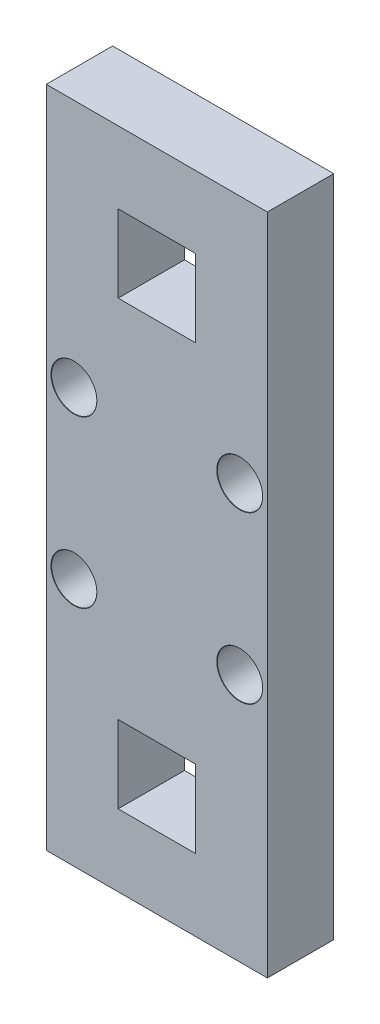
ISO-10303-21;
HEADER;
FILE_DESCRIPTION(('STEP AP214'),'2;1');
FILE_NAME('part.step','',(''),(''),'','','');
FILE_SCHEMA(('AUTOMOTIVE_DESIGN { 1 0 10303 214 1 1 1 1 }'));
ENDSEC;
DATA;
#1=APPLICATION_CONTEXT('core data for automotive mechanical design processes');
#2=APPLICATION_PROTOCOL_DEFINITION('international standard','automotive_design',2000,#1);
#3=PRODUCT_CONTEXT('',#1,'mechanical');
#4=PRODUCT('Part','Part','',(#3));
#5=PRODUCT_RELATED_PRODUCT_CATEGORY('part','',(#4));
#6=PRODUCT_DEFINITION_FORMATION('','',#4);
#7=PRODUCT_DEFINITION_CONTEXT('part definition',#1,'design');
#8=PRODUCT_DEFINITION('design','',#6,#7);
#9=PRODUCT_DEFINITION_SHAPE('','',#8);
#10=(LENGTH_UNIT() NAMED_UNIT(*) SI_UNIT(.MILLI.,.METRE.));
#11=(NAMED_UNIT(*) PLANE_ANGLE_UNIT() SI_UNIT($,.RADIAN.));
#12=(NAMED_UNIT(*) SI_UNIT($,.STERADIAN.) SOLID_ANGLE_UNIT());
#13=UNCERTAINTY_MEASURE_WITH_UNIT(LENGTH_MEASURE(1.E-05),#10,'distance_accuracy_value','');
#14=(GEOMETRIC_REPRESENTATION_CONTEXT(3) GLOBAL_UNCERTAINTY_ASSIGNED_CONTEXT((#13)) GLOBAL_UNIT_ASSIGNED_CONTEXT((#10,
#11,#12)) REPRESENTATION_CONTEXT('',''));
#15=CARTESIAN_POINT('',(0.,0.,0.));
#16=DIRECTION('',(0.,0.,1.));
#17=DIRECTION('',(1.,0.,0.));
#18=AXIS2_PLACEMENT_3D('',#15,#16,#17);
#19=CARTESIAN_POINT('',(0.,0.,6.));
#20=DIRECTION('',(0.,0.,-1.));
#21=DIRECTION('',(-1.,0.,0.));
#22=AXIS2_PLACEMENT_3D('',#19,#20,#21);
#23=PLANE('',#22);
#24=CARTESIAN_POINT('',(-7.5,7.5,6.));
#25=DIRECTION('',(0.,0.,1.));
#26=DIRECTION('',(1.,0.,0.));
#27=AXIS2_PLACEMENT_3D('',#24,#25,#26);
#28=CIRCLE('',#27,2.075);
#29=CARTESIAN_POINT('',(-5.425,7.5,6.));
#30=VERTEX_POINT('',#29);
#31=EDGE_CURVE('E308',#30,#30,#28,.T.);
#32=ORIENTED_EDGE('',*,*,#31,.F.);
#33=EDGE_LOOP('',(#32));
#34=FACE_BOUND('',#33,.T.);
#35=CARTESIAN_POINT('',(7.5,7.5,6.));
#36=DIRECTION('',(0.,0.,1.));
#37=DIRECTION('',(1.,0.,0.));
#38=AXIS2_PLACEMENT_3D('',#35,#36,#37);
#39=CIRCLE('',#38,2.075);
#40=CARTESIAN_POINT('',(9.575,7.5,6.));
#41=VERTEX_POINT('',#40);
#42=EDGE_CURVE('E296',#41,#41,#39,.T.);
#43=ORIENTED_EDGE('',*,*,#42,.F.);
#44=EDGE_LOOP('',(#43));
#45=FACE_BOUND('',#44,.T.);
#46=CARTESIAN_POINT('',(7.5,-7.5,6.));
#47=DIRECTION('',(0.,0.,1.));
#48=DIRECTION('',(1.,0.,0.));
#49=AXIS2_PLACEMENT_3D('',#46,#47,#48);
#50=CIRCLE('',#49,2.075);
#51=CARTESIAN_POINT('',(9.575,-7.5,6.));
#52=VERTEX_POINT('',#51);
#53=EDGE_CURVE('E284',#52,#52,#50,.T.);
#54=ORIENTED_EDGE('',*,*,#53,.F.);
#55=EDGE_LOOP('',(#54));
#56=FACE_BOUND('',#55,.T.);
#57=CARTESIAN_POINT('',(-7.5,-7.5,6.));
#58=DIRECTION('',(0.,0.,1.));
#59=DIRECTION('',(1.,0.,0.));
#60=AXIS2_PLACEMENT_3D('',#57,#58,#59);
#61=CIRCLE('',#60,2.075);
#62=CARTESIAN_POINT('',(-5.425,-7.5,6.));
#63=VERTEX_POINT('',#62);
#64=EDGE_CURVE('E272',#63,#63,#61,.T.);
#65=ORIENTED_EDGE('',*,*,#64,.F.);
#66=EDGE_LOOP('',(#65));
#67=FACE_BOUND('',#66,.T.);
#68=DIRECTION('',(1.,0.,0.));
#69=VECTOR('',#68,1.);
#70=CARTESIAN_POINT('',(0.,-16.5,6.));
#71=LINE('',#70,#69);
#72=CARTESIAN_POINT('',(-3.5,-16.5,6.));
#73=VERTEX_POINT('',#72);
#74=CARTESIAN_POINT('',(3.5,-16.5,6.));
#75=VERTEX_POINT('',#74);
#76=EDGE_CURVE('E141',#73,#75,#71,.T.);
#77=ORIENTED_EDGE('',*,*,#76,.T.);
#78=DIRECTION('',(0.,1.,0.));
#79=VECTOR('',#78,1.);
#80=CARTESIAN_POINT('',(3.5,0.,6.));
#81=LINE('',#80,#79);
#82=CARTESIAN_POINT('',(3.5,-23.5,6.));
#83=VERTEX_POINT('',#82);
#84=EDGE_CURVE('E55',#83,#75,#81,.T.);
#85=ORIENTED_EDGE('',*,*,#84,.F.);
#86=DIRECTION('',(1.,0.,0.));
#87=VECTOR('',#86,1.);
#88=CARTESIAN_POINT('',(0.,-23.5,6.));
#89=LINE('',#88,#87);
#90=CARTESIAN_POINT('',(-3.5,-23.5,6.));
#91=VERTEX_POINT('',#90);
#92=EDGE_CURVE('E148',#91,#83,#89,.T.);
#93=ORIENTED_EDGE('',*,*,#92,.F.);
#94=DIRECTION('',(0.,1.,0.));
#95=VECTOR('',#94,1.);
#96=CARTESIAN_POINT('',(-3.5,0.,6.));
#97=LINE('',#96,#95);
#98=EDGE_CURVE('E131',#91,#73,#97,.T.);
#99=ORIENTED_EDGE('',*,*,#98,.T.);
#100=EDGE_LOOP('',(#77,#85,#93,#99));
#101=FACE_BOUND('',#100,.T.);
#102=DIRECTION('',(0.,1.,0.));
#103=VECTOR('',#102,1.);
#104=CARTESIAN_POINT('',(10.,-30.,6.));
#105=LINE('',#104,#103);
#106=CARTESIAN_POINT('',(10.,-30.,6.));
#107=VERTEX_POINT('',#106);
#108=CARTESIAN_POINT('',(10.,30.,6.));
#109=VERTEX_POINT('',#108);
#110=EDGE_CURVE('E192',#107,#109,#105,.T.);
#111=ORIENTED_EDGE('',*,*,#110,.T.);
#112=DIRECTION('',(-1.,0.,0.));
#113=VECTOR('',#112,1.);
#114=CARTESIAN_POINT('',(-10.,30.,6.));
#115=LINE('',#114,#113);
#116=CARTESIAN_POINT('',(-10.,30.,6.));
#117=VERTEX_POINT('',#116);
#118=EDGE_CURVE('E196',#109,#117,#115,.T.);
#119=ORIENTED_EDGE('',*,*,#118,.T.);
#120=DIRECTION('',(0.,-1.,0.));
#121=VECTOR('',#120,1.);
#122=CARTESIAN_POINT('',(-10.,-30.,6.));
#123=LINE('',#122,#121);
#124=CARTESIAN_POINT('',(-10.,-30.,6.));
#125=VERTEX_POINT('',#124);
#126=EDGE_CURVE('E200',#117,#125,#123,.T.);
#127=ORIENTED_EDGE('',*,*,#126,.T.);
#128=DIRECTION('',(1.,0.,0.));
#129=VECTOR('',#128,1.);
#130=CARTESIAN_POINT('',(-10.,-30.,6.));
#131=LINE('',#130,#129);
#132=EDGE_CURVE('E203',#125,#107,#131,.T.);
#133=ORIENTED_EDGE('',*,*,#132,.T.);
#134=EDGE_LOOP('',(#111,#119,#127,#133));
#135=FACE_BOUND('',#134,.T.);
#136=DIRECTION('',(0.,-1.,0.));
#137=VECTOR('',#136,1.);
#138=CARTESIAN_POINT('',(3.5,0.,6.));
#139=LINE('',#138,#137);
#140=CARTESIAN_POINT('',(3.5,23.5,6.));
#141=VERTEX_POINT('',#140);
#142=CARTESIAN_POINT('',(3.5,16.5,6.));
#143=VERTEX_POINT('',#142);
#144=EDGE_CURVE('E158',#141,#143,#139,.T.);
#145=ORIENTED_EDGE('',*,*,#144,.T.);
#146=DIRECTION('',(1.,0.,0.));
#147=VECTOR('',#146,1.);
#148=CARTESIAN_POINT('',(0.,16.5,6.));
#149=LINE('',#148,#147);
#150=CARTESIAN_POINT('',(-3.5,16.5,6.));
#151=VERTEX_POINT('',#150);
#152=EDGE_CURVE('E174',#151,#143,#149,.T.);
#153=ORIENTED_EDGE('',*,*,#152,.F.);
#154=DIRECTION('',(0.,-1.,0.));
#155=VECTOR('',#154,1.);
#156=CARTESIAN_POINT('',(-3.5,0.,6.));
#157=LINE('',#156,#155);
#158=CARTESIAN_POINT('',(-3.5,23.5,6.));
#159=VERTEX_POINT('',#158);
#160=EDGE_CURVE('E170',#159,#151,#157,.T.);
#161=ORIENTED_EDGE('',*,*,#160,.F.);
#162=DIRECTION('',(1.,0.,0.));
#163=VECTOR('',#162,1.);
#164=CARTESIAN_POINT('',(0.,23.5,6.));
#165=LINE('',#164,#163);
#166=EDGE_CURVE('E166',#159,#141,#165,.T.);
#167=ORIENTED_EDGE('',*,*,#166,.T.);
#168=EDGE_LOOP('',(#145,#153,#161,#167));
#169=FACE_BOUND('',#168,.T.);
#170=ADVANCED_FACE('F39',(#34,#45,#56,#67,#101,#135,#169),#23,.F.);
#171=CARTESIAN_POINT('',(0.,0.,0.));
#172=DIRECTION('',(0.,0.,-1.));
#173=DIRECTION('',(-1.,0.,0.));
#174=AXIS2_PLACEMENT_3D('',#171,#172,#173);
#175=PLANE('',#174);
#176=CARTESIAN_POINT('',(-7.5,7.5,0.));
#177=DIRECTION('',(0.,0.,1.));
#178=DIRECTION('',(1.,0.,0.));
#179=AXIS2_PLACEMENT_3D('',#176,#177,#178);
#180=CIRCLE('',#179,2.05);
#181=CARTESIAN_POINT('',(-5.45,7.5,0.));
#182=VERTEX_POINT('',#181);
#183=EDGE_CURVE('E300',#182,#182,#180,.T.);
#184=ORIENTED_EDGE('',*,*,#183,.T.);
#185=EDGE_LOOP('',(#184));
#186=FACE_BOUND('',#185,.T.);
#187=CARTESIAN_POINT('',(7.5,7.5,0.));
#188=DIRECTION('',(0.,0.,1.));
#189=DIRECTION('',(1.,0.,0.));
#190=AXIS2_PLACEMENT_3D('',#187,#188,#189);
#191=CIRCLE('',#190,2.05);
#192=CARTESIAN_POINT('',(9.55,7.5,0.));
#193=VERTEX_POINT('',#192);
#194=EDGE_CURVE('E288',#193,#193,#191,.T.);
#195=ORIENTED_EDGE('',*,*,#194,.T.);
#196=EDGE_LOOP('',(#195));
#197=FACE_BOUND('',#196,.T.);
#198=CARTESIAN_POINT('',(7.5,-7.5,0.));
#199=DIRECTION('',(0.,0.,1.));
#200=DIRECTION('',(1.,0.,0.));
#201=AXIS2_PLACEMENT_3D('',#198,#199,#200);
#202=CIRCLE('',#201,2.05);
#203=CARTESIAN_POINT('',(9.55,-7.5,0.));
#204=VERTEX_POINT('',#203);
#205=EDGE_CURVE('E276',#204,#204,#202,.T.);
#206=ORIENTED_EDGE('',*,*,#205,.T.);
#207=EDGE_LOOP('',(#206));
#208=FACE_BOUND('',#207,.T.);
#209=CARTESIAN_POINT('',(-7.5,-7.5,0.));
#210=DIRECTION('',(0.,0.,1.));
#211=DIRECTION('',(1.,0.,0.));
#212=AXIS2_PLACEMENT_3D('',#209,#210,#211);
#213=CIRCLE('',#212,2.05);
#214=CARTESIAN_POINT('',(-5.45,-7.5,0.));
#215=VERTEX_POINT('',#214);
#216=EDGE_CURVE('E263',#215,#215,#213,.T.);
#217=ORIENTED_EDGE('',*,*,#216,.T.);
#218=EDGE_LOOP('',(#217));
#219=FACE_BOUND('',#218,.T.);
#220=DIRECTION('',(0.,-1.,0.));
#221=VECTOR('',#220,1.);
#222=CARTESIAN_POINT('',(3.5,0.,0.));
#223=LINE('',#222,#221);
#224=CARTESIAN_POINT('',(3.5,-16.5,0.));
#225=VERTEX_POINT('',#224);
#226=CARTESIAN_POINT('',(3.5,-23.5,0.));
#227=VERTEX_POINT('',#226);
#228=EDGE_CURVE('E11',#225,#227,#223,.T.);
#229=ORIENTED_EDGE('',*,*,#228,.F.);
#230=DIRECTION('',(-1.,0.,0.));
#231=VECTOR('',#230,1.);
#232=CARTESIAN_POINT('',(0.,-16.5,0.));
#233=LINE('',#232,#231);
#234=CARTESIAN_POINT('',(-3.5,-16.5,0.));
#235=VERTEX_POINT('',#234);
#236=EDGE_CURVE('E248',#225,#235,#233,.T.);
#237=ORIENTED_EDGE('',*,*,#236,.T.);
#238=DIRECTION('',(0.,-1.,0.));
#239=VECTOR('',#238,1.);
#240=CARTESIAN_POINT('',(-3.5,0.,0.));
#241=LINE('',#240,#239);
#242=CARTESIAN_POINT('',(-3.5,-23.5,0.));
#243=VERTEX_POINT('',#242);
#244=EDGE_CURVE('E134',#235,#243,#241,.T.);
#245=ORIENTED_EDGE('',*,*,#244,.T.);
#246=DIRECTION('',(-1.,0.,0.));
#247=VECTOR('',#246,1.);
#248=CARTESIAN_POINT('',(0.,-23.5,0.));
#249=LINE('',#248,#247);
#250=EDGE_CURVE('E48',#227,#243,#249,.T.);
#251=ORIENTED_EDGE('',*,*,#250,.F.);
#252=EDGE_LOOP('',(#229,#237,#245,#251));
#253=FACE_BOUND('',#252,.T.);
#254=DIRECTION('',(0.,1.,0.));
#255=VECTOR('',#254,1.);
#256=CARTESIAN_POINT('',(10.,-30.,0.));
#257=LINE('',#256,#255);
#258=CARTESIAN_POINT('',(10.,-30.,0.));
#259=VERTEX_POINT('',#258);
#260=CARTESIAN_POINT('',(10.,30.,0.));
#261=VERTEX_POINT('',#260);
#262=EDGE_CURVE('E182',#259,#261,#257,.T.);
#263=ORIENTED_EDGE('',*,*,#262,.F.);
#264=DIRECTION('',(1.,0.,0.));
#265=VECTOR('',#264,1.);
#266=CARTESIAN_POINT('',(-10.,-30.,0.));
#267=LINE('',#266,#265);
#268=CARTESIAN_POINT('',(-10.,-30.,0.));
#269=VERTEX_POINT('',#268);
#270=EDGE_CURVE('E197',#269,#259,#267,.T.);
#271=ORIENTED_EDGE('',*,*,#270,.F.);
#272=DIRECTION('',(0.,-1.,0.));
#273=VECTOR('',#272,1.);
#274=CARTESIAN_POINT('',(-10.,-30.,0.));
#275=LINE('',#274,#273);
#276=CARTESIAN_POINT('',(-10.,30.,0.));
#277=VERTEX_POINT('',#276);
#278=EDGE_CURVE('E213',#277,#269,#275,.T.);
#279=ORIENTED_EDGE('',*,*,#278,.F.);
#280=DIRECTION('',(-1.,0.,0.));
#281=VECTOR('',#280,1.);
#282=CARTESIAN_POINT('',(-10.,30.,0.));
#283=LINE('',#282,#281);
#284=EDGE_CURVE('E210',#261,#277,#283,.T.);
#285=ORIENTED_EDGE('',*,*,#284,.F.);
#286=EDGE_LOOP('',(#263,#271,#279,#285));
#287=FACE_BOUND('',#286,.T.);
#288=DIRECTION('',(-1.,0.,0.));
#289=VECTOR('',#288,1.);
#290=CARTESIAN_POINT('',(0.,16.5,0.));
#291=LINE('',#290,#289);
#292=CARTESIAN_POINT('',(3.5,16.5,0.));
#293=VERTEX_POINT('',#292);
#294=CARTESIAN_POINT('',(-3.5,16.5,0.));
#295=VERTEX_POINT('',#294);
#296=EDGE_CURVE('E241',#293,#295,#291,.T.);
#297=ORIENTED_EDGE('',*,*,#296,.F.);
#298=DIRECTION('',(0.,1.,0.));
#299=VECTOR('',#298,1.);
#300=CARTESIAN_POINT('',(3.5,0.,0.));
#301=LINE('',#300,#299);
#302=CARTESIAN_POINT('',(3.5,23.5,0.));
#303=VERTEX_POINT('',#302);
#304=EDGE_CURVE('E244',#293,#303,#301,.T.);
#305=ORIENTED_EDGE('',*,*,#304,.T.);
#306=DIRECTION('',(-1.,0.,0.));
#307=VECTOR('',#306,1.);
#308=CARTESIAN_POINT('',(0.,23.5,0.));
#309=LINE('',#308,#307);
#310=CARTESIAN_POINT('',(-3.5,23.5,0.));
#311=VERTEX_POINT('',#310);
#312=EDGE_CURVE('E233',#303,#311,#309,.T.);
#313=ORIENTED_EDGE('',*,*,#312,.T.);
#314=DIRECTION('',(0.,1.,0.));
#315=VECTOR('',#314,1.);
#316=CARTESIAN_POINT('',(-3.5,0.,0.));
#317=LINE('',#316,#315);
#318=EDGE_CURVE('E237',#295,#311,#317,.T.);
#319=ORIENTED_EDGE('',*,*,#318,.F.);
#320=EDGE_LOOP('',(#297,#305,#313,#319));
#321=FACE_BOUND('',#320,.T.);
#322=ADVANCED_FACE('F259',(#186,#197,#208,#219,#253,#287,#321),#175,.T.);
#323=CARTESIAN_POINT('',(10.,-30.,6.));
#324=DIRECTION('',(-1.,0.,0.));
#325=DIRECTION('',(0.,0.,1.));
#326=AXIS2_PLACEMENT_3D('',#323,#324,#325);
#327=PLANE('',#326);
#328=ORIENTED_EDGE('',*,*,#262,.T.);
#329=DIRECTION('',(0.,0.,-1.));
#330=VECTOR('',#329,1.);
#331=CARTESIAN_POINT('',(10.,30.,6.));
#332=LINE('',#331,#330);
#333=EDGE_CURVE('E229',#109,#261,#332,.T.);
#334=ORIENTED_EDGE('',*,*,#333,.F.);
#335=ORIENTED_EDGE('',*,*,#110,.F.);
#336=DIRECTION('',(0.,0.,-1.));
#337=VECTOR('',#336,1.);
#338=CARTESIAN_POINT('',(10.,-30.,6.));
#339=LINE('',#338,#337);
#340=EDGE_CURVE('E206',#107,#259,#339,.T.);
#341=ORIENTED_EDGE('',*,*,#340,.T.);
#342=EDGE_LOOP('',(#328,#334,#335,#341));
#343=FACE_BOUND('',#342,.T.);
#344=ADVANCED_FACE('F41',(#343),#327,.F.);
#345=CARTESIAN_POINT('',(-10.,30.,6.));
#346=DIRECTION('',(0.,-1.,0.));
#347=DIRECTION('',(0.,0.,-1.));
#348=AXIS2_PLACEMENT_3D('',#345,#346,#347);
#349=PLANE('',#348);
#350=ORIENTED_EDGE('',*,*,#284,.T.);
#351=DIRECTION('',(0.,0.,-1.));
#352=VECTOR('',#351,1.);
#353=CARTESIAN_POINT('',(-10.,30.,6.));
#354=LINE('',#353,#352);
#355=EDGE_CURVE('E225',#117,#277,#354,.T.);
#356=ORIENTED_EDGE('',*,*,#355,.F.);
#357=ORIENTED_EDGE('',*,*,#118,.F.);
#358=ORIENTED_EDGE('',*,*,#333,.T.);
#359=EDGE_LOOP('',(#350,#356,#357,#358));
#360=FACE_BOUND('',#359,.T.);
#361=ADVANCED_FACE('F375',(#360),#349,.F.);
#362=CARTESIAN_POINT('',(-10.,-30.,6.));
#363=DIRECTION('',(1.,0.,0.));
#364=DIRECTION('',(0.,0.,-1.));
#365=AXIS2_PLACEMENT_3D('',#362,#363,#364);
#366=PLANE('',#365);
#367=ORIENTED_EDGE('',*,*,#278,.T.);
#368=DIRECTION('',(0.,0.,-1.));
#369=VECTOR('',#368,1.);
#370=CARTESIAN_POINT('',(-10.,-30.,6.));
#371=LINE('',#370,#369);
#372=EDGE_CURVE('E221',#125,#269,#371,.T.);
#373=ORIENTED_EDGE('',*,*,#372,.F.);
#374=ORIENTED_EDGE('',*,*,#126,.F.);
#375=ORIENTED_EDGE('',*,*,#355,.T.);
#376=EDGE_LOOP('',(#367,#373,#374,#375));
#377=FACE_BOUND('',#376,.T.);
#378=ADVANCED_FACE('F372',(#377),#366,.F.);
#379=CARTESIAN_POINT('',(-10.,-30.,6.));
#380=DIRECTION('',(0.,1.,0.));
#381=DIRECTION('',(0.,0.,1.));
#382=AXIS2_PLACEMENT_3D('',#379,#380,#381);
#383=PLANE('',#382);
#384=ORIENTED_EDGE('',*,*,#270,.T.);
#385=ORIENTED_EDGE('',*,*,#340,.F.);
#386=ORIENTED_EDGE('',*,*,#132,.F.);
#387=ORIENTED_EDGE('',*,*,#372,.T.);
#388=EDGE_LOOP('',(#384,#385,#386,#387));
#389=FACE_BOUND('',#388,.T.);
#390=ADVANCED_FACE('F364',(#389),#383,.F.);
#391=CARTESIAN_POINT('',(3.5,0.,-4.));
#392=DIRECTION('',(-1.,0.,0.));
#393=DIRECTION('',(0.,-1.,0.));
#394=AXIS2_PLACEMENT_3D('',#391,#392,#393);
#395=PLANE('',#394);
#396=DIRECTION('',(0.,0.,1.));
#397=VECTOR('',#396,1.);
#398=CARTESIAN_POINT('',(3.5,16.5,-4.));
#399=LINE('',#398,#397);
#400=EDGE_CURVE('E179',#293,#143,#399,.T.);
#401=ORIENTED_EDGE('',*,*,#400,.T.);
#402=ORIENTED_EDGE('',*,*,#144,.F.);
#403=DIRECTION('',(0.,0.,1.));
#404=VECTOR('',#403,1.);
#405=CARTESIAN_POINT('',(3.5,23.5,-4.));
#406=LINE('',#405,#404);
#407=EDGE_CURVE('E178',#303,#141,#406,.T.);
#408=ORIENTED_EDGE('',*,*,#407,.F.);
#409=ORIENTED_EDGE('',*,*,#304,.F.);
#410=EDGE_LOOP('',(#401,#402,#408,#409));
#411=FACE_BOUND('',#410,.T.);
#412=ADVANCED_FACE('F355',(#411),#395,.T.);
#413=CARTESIAN_POINT('',(0.,16.5,-4.));
#414=DIRECTION('',(0.,-1.,0.));
#415=DIRECTION('',(0.,0.,-1.));
#416=AXIS2_PLACEMENT_3D('',#413,#414,#415);
#417=PLANE('',#416);
#418=ORIENTED_EDGE('',*,*,#296,.T.);
#419=DIRECTION('',(0.,0.,1.));
#420=VECTOR('',#419,1.);
#421=CARTESIAN_POINT('',(-3.5,16.5,-4.));
#422=LINE('',#421,#420);
#423=EDGE_CURVE('E183',#295,#151,#422,.T.);
#424=ORIENTED_EDGE('',*,*,#423,.T.);
#425=ORIENTED_EDGE('',*,*,#152,.T.);
#426=ORIENTED_EDGE('',*,*,#400,.F.);
#427=EDGE_LOOP('',(#418,#424,#425,#426));
#428=FACE_BOUND('',#427,.T.);
#429=ADVANCED_FACE('F351',(#428),#417,.F.);
#430=CARTESIAN_POINT('',(-3.5,0.,-4.));
#431=DIRECTION('',(-1.,0.,0.));
#432=DIRECTION('',(0.,-1.,0.));
#433=AXIS2_PLACEMENT_3D('',#430,#431,#432);
#434=PLANE('',#433);
#435=ORIENTED_EDGE('',*,*,#318,.T.);
#436=DIRECTION('',(0.,0.,1.));
#437=VECTOR('',#436,1.);
#438=CARTESIAN_POINT('',(-3.5,23.5,-4.));
#439=LINE('',#438,#437);
#440=EDGE_CURVE('E186',#311,#159,#439,.T.);
#441=ORIENTED_EDGE('',*,*,#440,.T.);
#442=ORIENTED_EDGE('',*,*,#160,.T.);
#443=ORIENTED_EDGE('',*,*,#423,.F.);
#444=EDGE_LOOP('',(#435,#441,#442,#443));
#445=FACE_BOUND('',#444,.T.);
#446=ADVANCED_FACE('F354',(#445),#434,.F.);
#447=CARTESIAN_POINT('',(0.,23.5,-4.));
#448=DIRECTION('',(0.,-1.,0.));
#449=DIRECTION('',(0.,0.,-1.));
#450=AXIS2_PLACEMENT_3D('',#447,#448,#449);
#451=PLANE('',#450);
#452=ORIENTED_EDGE('',*,*,#407,.T.);
#453=ORIENTED_EDGE('',*,*,#166,.F.);
#454=ORIENTED_EDGE('',*,*,#440,.F.);
#455=ORIENTED_EDGE('',*,*,#312,.F.);
#456=EDGE_LOOP('',(#452,#453,#454,#455));
#457=FACE_BOUND('',#456,.T.);
#458=ADVANCED_FACE('F350',(#457),#451,.T.);
#459=CARTESIAN_POINT('',(3.5,0.,-4.));
#460=DIRECTION('',(1.,0.,0.));
#461=DIRECTION('',(0.,1.,0.));
#462=AXIS2_PLACEMENT_3D('',#459,#460,#461);
#463=PLANE('',#462);
#464=ORIENTED_EDGE('',*,*,#228,.T.);
#465=DIRECTION('',(0.,0.,1.));
#466=VECTOR('',#465,1.);
#467=CARTESIAN_POINT('',(3.5,-23.5,-4.));
#468=LINE('',#467,#466);
#469=EDGE_CURVE('E155',#227,#83,#468,.T.);
#470=ORIENTED_EDGE('',*,*,#469,.T.);
#471=ORIENTED_EDGE('',*,*,#84,.T.);
#472=DIRECTION('',(0.,0.,1.));
#473=VECTOR('',#472,1.);
#474=CARTESIAN_POINT('',(3.5,-16.5,-4.));
#475=LINE('',#474,#473);
#476=EDGE_CURVE('E138',#225,#75,#475,.T.);
#477=ORIENTED_EDGE('',*,*,#476,.F.);
#478=EDGE_LOOP('',(#464,#470,#471,#477));
#479=FACE_BOUND('',#478,.T.);
#480=ADVANCED_FACE('F261',(#479),#463,.F.);
#481=CARTESIAN_POINT('',(0.,-23.5,-4.));
#482=DIRECTION('',(0.,-1.,0.));
#483=DIRECTION('',(0.,0.,-1.));
#484=AXIS2_PLACEMENT_3D('',#481,#482,#483);
#485=PLANE('',#484);
#486=ORIENTED_EDGE('',*,*,#250,.T.);
#487=DIRECTION('',(0.,0.,1.));
#488=VECTOR('',#487,1.);
#489=CARTESIAN_POINT('',(-3.5,-23.5,-4.));
#490=LINE('',#489,#488);
#491=EDGE_CURVE('E137',#243,#91,#490,.T.);
#492=ORIENTED_EDGE('',*,*,#491,.T.);
#493=ORIENTED_EDGE('',*,*,#92,.T.);
#494=ORIENTED_EDGE('',*,*,#469,.F.);
#495=EDGE_LOOP('',(#486,#492,#493,#494));
#496=FACE_BOUND('',#495,.T.);
#497=ADVANCED_FACE('F256',(#496),#485,.F.);
#498=CARTESIAN_POINT('',(-3.5,0.,-4.));
#499=DIRECTION('',(1.,0.,0.));
#500=DIRECTION('',(0.,1.,0.));
#501=AXIS2_PLACEMENT_3D('',#498,#499,#500);
#502=PLANE('',#501);
#503=DIRECTION('',(0.,0.,1.));
#504=VECTOR('',#503,1.);
#505=CARTESIAN_POINT('',(-3.5,-16.5,-4.));
#506=LINE('',#505,#504);
#507=EDGE_CURVE('E63',#235,#73,#506,.T.);
#508=ORIENTED_EDGE('',*,*,#507,.T.);
#509=ORIENTED_EDGE('',*,*,#98,.F.);
#510=ORIENTED_EDGE('',*,*,#491,.F.);
#511=ORIENTED_EDGE('',*,*,#244,.F.);
#512=EDGE_LOOP('',(#508,#509,#510,#511));
#513=FACE_BOUND('',#512,.T.);
#514=ADVANCED_FACE('F128',(#513),#502,.T.);
#515=CARTESIAN_POINT('',(0.,-16.5,-4.));
#516=DIRECTION('',(0.,-1.,0.));
#517=DIRECTION('',(0.,0.,-1.));
#518=AXIS2_PLACEMENT_3D('',#515,#516,#517);
#519=PLANE('',#518);
#520=ORIENTED_EDGE('',*,*,#476,.T.);
#521=ORIENTED_EDGE('',*,*,#76,.F.);
#522=ORIENTED_EDGE('',*,*,#507,.F.);
#523=ORIENTED_EDGE('',*,*,#236,.F.);
#524=EDGE_LOOP('',(#520,#521,#522,#523));
#525=FACE_BOUND('',#524,.T.);
#526=ADVANCED_FACE('F142',(#525),#519,.T.);
#527=CARTESIAN_POINT('',(-7.5,-7.5,6.));
#528=DIRECTION('',(0.,0.,1.));
#529=DIRECTION('',(1.,0.,0.));
#530=AXIS2_PLACEMENT_3D('',#527,#528,#529);
#531=CYLINDRICAL_SURFACE('',#530,2.04999999999999);
#532=ORIENTED_EDGE('',*,*,#216,.F.);
#533=EDGE_LOOP('',(#532));
#534=FACE_BOUND('',#533,.T.);
#535=CARTESIAN_POINT('',(-7.5,-7.5,5.975));
#536=DIRECTION('',(0.,0.,1.));
#537=DIRECTION('',(1.,0.,0.));
#538=AXIS2_PLACEMENT_3D('',#535,#536,#537);
#539=CIRCLE('',#538,2.04999999999999);
#540=CARTESIAN_POINT('',(-5.45000000000001,-7.5,5.975));
#541=VERTEX_POINT('',#540);
#542=EDGE_CURVE('E266',#541,#541,#539,.T.);
#543=ORIENTED_EDGE('',*,*,#542,.T.);
#544=EDGE_LOOP('',(#543));
#545=FACE_BOUND('',#544,.T.);
#546=ADVANCED_FACE('F327',(#534,#545),#531,.F.);
#547=CARTESIAN_POINT('',(-7.5,-7.5,6.));
#548=DIRECTION('',(0.,0.,1.));
#549=DIRECTION('',(1.,0.,0.));
#550=AXIS2_PLACEMENT_3D('',#547,#548,#549);
#551=CONICAL_SURFACE('',#550,2.075,0.785398163397726);
#552=ORIENTED_EDGE('',*,*,#542,.F.);
#553=EDGE_LOOP('',(#552));
#554=FACE_BOUND('',#553,.T.);
#555=ORIENTED_EDGE('',*,*,#64,.T.);
#556=EDGE_LOOP('',(#555));
#557=FACE_BOUND('',#556,.T.);
#558=ADVANCED_FACE('F324',(#554,#557),#551,.F.);
#559=CARTESIAN_POINT('',(7.5,-7.5,6.));
#560=DIRECTION('',(0.,0.,1.));
#561=DIRECTION('',(1.,0.,0.));
#562=AXIS2_PLACEMENT_3D('',#559,#560,#561);
#563=CYLINDRICAL_SURFACE('',#562,2.04999999999999);
#564=ORIENTED_EDGE('',*,*,#205,.F.);
#565=EDGE_LOOP('',(#564));
#566=FACE_BOUND('',#565,.T.);
#567=CARTESIAN_POINT('',(7.5,-7.5,5.975));
#568=DIRECTION('',(0.,0.,1.));
#569=DIRECTION('',(1.,0.,0.));
#570=AXIS2_PLACEMENT_3D('',#567,#568,#569);
#571=CIRCLE('',#570,2.04999999999999);
#572=CARTESIAN_POINT('',(9.54999999999998,-7.5,5.975));
#573=VERTEX_POINT('',#572);
#574=EDGE_CURVE('E280',#573,#573,#571,.T.);
#575=ORIENTED_EDGE('',*,*,#574,.T.);
#576=EDGE_LOOP('',(#575));
#577=FACE_BOUND('',#576,.T.);
#578=ADVANCED_FACE('F326',(#566,#577),#563,.F.);
#579=CARTESIAN_POINT('',(7.5,-7.5,6.));
#580=DIRECTION('',(0.,0.,1.));
#581=DIRECTION('',(1.,0.,0.));
#582=AXIS2_PLACEMENT_3D('',#579,#580,#581);
#583=CONICAL_SURFACE('',#582,2.075,0.78539816339776);
#584=ORIENTED_EDGE('',*,*,#574,.F.);
#585=EDGE_LOOP('',(#584));
#586=FACE_BOUND('',#585,.T.);
#587=ORIENTED_EDGE('',*,*,#53,.T.);
#588=EDGE_LOOP('',(#587));
#589=FACE_BOUND('',#588,.T.);
#590=ADVANCED_FACE('F334',(#586,#589),#583,.F.);
#591=CARTESIAN_POINT('',(7.5,7.5,6.));
#592=DIRECTION('',(0.,0.,1.));
#593=DIRECTION('',(1.,0.,0.));
#594=AXIS2_PLACEMENT_3D('',#591,#592,#593);
#595=CYLINDRICAL_SURFACE('',#594,2.04999999999999);
#596=ORIENTED_EDGE('',*,*,#194,.F.);
#597=EDGE_LOOP('',(#596));
#598=FACE_BOUND('',#597,.T.);
#599=CARTESIAN_POINT('',(7.5,7.5,5.975));
#600=DIRECTION('',(0.,0.,1.));
#601=DIRECTION('',(1.,0.,0.));
#602=AXIS2_PLACEMENT_3D('',#599,#600,#601);
#603=CIRCLE('',#602,2.04999999999999);
#604=CARTESIAN_POINT('',(9.54999999999998,7.5,5.975));
#605=VERTEX_POINT('',#604);
#606=EDGE_CURVE('E292',#605,#605,#603,.T.);
#607=ORIENTED_EDGE('',*,*,#606,.T.);
#608=EDGE_LOOP('',(#607));
#609=FACE_BOUND('',#608,.T.);
#610=ADVANCED_FACE('F506',(#598,#609),#595,.F.);
#611=CARTESIAN_POINT('',(7.5,7.5,6.));
#612=DIRECTION('',(0.,0.,1.));
#613=DIRECTION('',(1.,0.,0.));
#614=AXIS2_PLACEMENT_3D('',#611,#612,#613);
#615=CONICAL_SURFACE('',#614,2.075,0.78539816339776);
#616=ORIENTED_EDGE('',*,*,#606,.F.);
#617=EDGE_LOOP('',(#616));
#618=FACE_BOUND('',#617,.T.);
#619=ORIENTED_EDGE('',*,*,#42,.T.);
#620=EDGE_LOOP('',(#619));
#621=FACE_BOUND('',#620,.T.);
#622=ADVANCED_FACE('F515',(#618,#621),#615,.F.);
#623=CARTESIAN_POINT('',(-7.5,7.5,6.));
#624=DIRECTION('',(0.,0.,1.));
#625=DIRECTION('',(1.,0.,0.));
#626=AXIS2_PLACEMENT_3D('',#623,#624,#625);
#627=CYLINDRICAL_SURFACE('',#626,2.04999999999999);
#628=ORIENTED_EDGE('',*,*,#183,.F.);
#629=EDGE_LOOP('',(#628));
#630=FACE_BOUND('',#629,.T.);
#631=CARTESIAN_POINT('',(-7.5,7.5,5.975));
#632=DIRECTION('',(0.,0.,1.));
#633=DIRECTION('',(1.,0.,0.));
#634=AXIS2_PLACEMENT_3D('',#631,#632,#633);
#635=CIRCLE('',#634,2.04999999999999);
#636=CARTESIAN_POINT('',(-5.45000000000001,7.5,5.975));
#637=VERTEX_POINT('',#636);
#638=EDGE_CURVE('E304',#637,#637,#635,.T.);
#639=ORIENTED_EDGE('',*,*,#638,.T.);
#640=EDGE_LOOP('',(#639));
#641=FACE_BOUND('',#640,.T.);
#642=ADVANCED_FACE('F525',(#630,#641),#627,.F.);
#643=CARTESIAN_POINT('',(-7.5,7.5,6.));
#644=DIRECTION('',(0.,0.,1.));
#645=DIRECTION('',(1.,0.,0.));
#646=AXIS2_PLACEMENT_3D('',#643,#644,#645);
#647=CONICAL_SURFACE('',#646,2.075,0.785398163397726);
#648=ORIENTED_EDGE('',*,*,#638,.F.);
#649=EDGE_LOOP('',(#648));
#650=FACE_BOUND('',#649,.T.);
#651=ORIENTED_EDGE('',*,*,#31,.T.);
#652=EDGE_LOOP('',(#651));
#653=FACE_BOUND('',#652,.T.);
#654=ADVANCED_FACE('F313',(#650,#653),#647,.F.);
#655=CLOSED_SHELL('',(#170,#322,#344,#361,#378,#390,#412,#429,#446,#458,#480,#497,#514,#526,
#546,#558,#578,#590,#610,#622,#642,#654));
#656=MANIFOLD_SOLID_BREP('B2',#655);
#657=ADVANCED_BREP_SHAPE_REPRESENTATION('',(#18,#656),#14);
#658=SHAPE_DEFINITION_REPRESENTATION(#9,#657);
ENDSEC;
END-ISO-10303-21;
